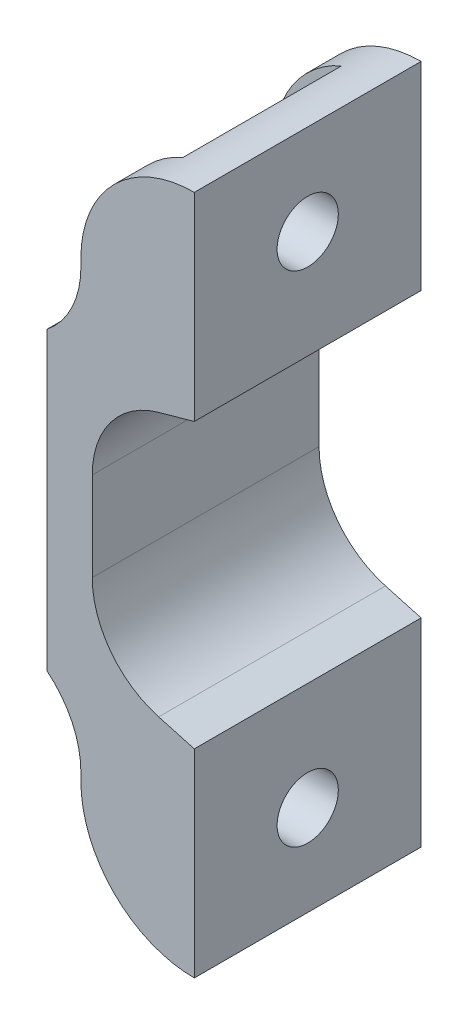
ISO-10303-21;
HEADER;
FILE_DESCRIPTION(('STEP AP214'),'2;1');
FILE_NAME('part.step','',(''),(''),'','','');
FILE_SCHEMA(('AUTOMOTIVE_DESIGN { 1 0 10303 214 1 1 1 1 }'));
ENDSEC;
DATA;
#1=APPLICATION_CONTEXT('core data for automotive mechanical design processes');
#2=APPLICATION_PROTOCOL_DEFINITION('international standard','automotive_design',2000,#1);
#3=PRODUCT_CONTEXT('',#1,'mechanical');
#4=PRODUCT('Part','Part','',(#3));
#5=PRODUCT_RELATED_PRODUCT_CATEGORY('part','',(#4));
#6=PRODUCT_DEFINITION_FORMATION('','',#4);
#7=PRODUCT_DEFINITION_CONTEXT('part definition',#1,'design');
#8=PRODUCT_DEFINITION('design','',#6,#7);
#9=PRODUCT_DEFINITION_SHAPE('','',#8);
#10=(LENGTH_UNIT() NAMED_UNIT(*) SI_UNIT(.MILLI.,.METRE.));
#11=(NAMED_UNIT(*) PLANE_ANGLE_UNIT() SI_UNIT($,.RADIAN.));
#12=(NAMED_UNIT(*) SI_UNIT($,.STERADIAN.) SOLID_ANGLE_UNIT());
#13=UNCERTAINTY_MEASURE_WITH_UNIT(LENGTH_MEASURE(1.E-05),#10,'distance_accuracy_value','');
#14=(GEOMETRIC_REPRESENTATION_CONTEXT(3) GLOBAL_UNCERTAINTY_ASSIGNED_CONTEXT((#13)) GLOBAL_UNIT_ASSIGNED_CONTEXT((#10,
#11,#12)) REPRESENTATION_CONTEXT('',''));
#15=CARTESIAN_POINT('',(0.,0.,0.));
#16=DIRECTION('',(0.,0.,1.));
#17=DIRECTION('',(1.,0.,0.));
#18=AXIS2_PLACEMENT_3D('',#15,#16,#17);
#19=CARTESIAN_POINT('',(0.,30.,-10.));
#20=DIRECTION('',(1.,0.,0.));
#21=DIRECTION('',(0.,0.,-1.));
#22=AXIS2_PLACEMENT_3D('',#19,#20,#21);
#23=PLANE('',#22);
#24=DIRECTION('',(0.,1.,0.));
#25=VECTOR('',#24,1.);
#26=CARTESIAN_POINT('',(0.,30.,10.));
#27=LINE('',#26,#25);
#28=CARTESIAN_POINT('',(0.,12.5,10.));
#29=VERTEX_POINT('',#28);
#30=CARTESIAN_POINT('',(0.,30.,10.));
#31=VERTEX_POINT('',#30);
#32=EDGE_CURVE('E325',#29,#31,#27,.T.);
#33=ORIENTED_EDGE('',*,*,#32,.F.);
#34=DIRECTION('',(0.,0.,1.));
#35=VECTOR('',#34,1.);
#36=CARTESIAN_POINT('',(0.,12.5,-10.));
#37=LINE('',#36,#35);
#38=CARTESIAN_POINT('',(0.,12.5,-10.));
#39=VERTEX_POINT('',#38);
#40=EDGE_CURVE('E299',#39,#29,#37,.T.);
#41=ORIENTED_EDGE('',*,*,#40,.F.);
#42=DIRECTION('',(0.,1.,0.));
#43=VECTOR('',#42,1.);
#44=CARTESIAN_POINT('',(0.,30.,-10.));
#45=LINE('',#44,#43);
#46=CARTESIAN_POINT('',(0.,30.,-10.));
#47=VERTEX_POINT('',#46);
#48=EDGE_CURVE('E255',#39,#47,#45,.T.);
#49=ORIENTED_EDGE('',*,*,#48,.T.);
#50=DIRECTION('',(0.,0.,1.));
#51=VECTOR('',#50,1.);
#52=CARTESIAN_POINT('',(0.,30.,-10.));
#53=LINE('',#52,#51);
#54=EDGE_CURVE('E305',#47,#31,#53,.T.);
#55=ORIENTED_EDGE('',*,*,#54,.T.);
#56=EDGE_LOOP('',(#33,#41,#49,#55));
#57=FACE_BOUND('',#56,.T.);
#58=CARTESIAN_POINT('',(0.,22.,0.));
#59=DIRECTION('',(1.,0.,0.));
#60=DIRECTION('',(0.,0.,-1.));
#61=AXIS2_PLACEMENT_3D('',#58,#59,#60);
#62=CIRCLE('',#61,2.7);
#63=CARTESIAN_POINT('',(0.,22.,-2.69999999999999));
#64=VERTEX_POINT('',#63);
#65=EDGE_CURVE('E346',#64,#64,#62,.T.);
#66=ORIENTED_EDGE('',*,*,#65,.F.);
#67=EDGE_LOOP('',(#66));
#68=FACE_BOUND('',#67,.T.);
#69=ADVANCED_FACE('F49',(#57,#68),#23,.T.);
#70=CARTESIAN_POINT('',(0.,12.5,-10.));
#71=DIRECTION('',(0.267643863786094,-0.963517909629941,0.));
#72=DIRECTION('',(0.963517909629941,0.267643863786094,0.));
#73=AXIS2_PLACEMENT_3D('',#70,#71,#72);
#74=PLANE('',#73);
#75=DIRECTION('',(0.963517909629941,0.267643863786094,0.));
#76=VECTOR('',#75,1.);
#77=CARTESIAN_POINT('',(0.,12.5,10.));
#78=LINE('',#77,#76);
#79=CARTESIAN_POINT('',(-3.14115091028876,11.6274580804753,10.));
#80=VERTEX_POINT('',#79);
#81=EDGE_CURVE('E328',#80,#29,#78,.T.);
#82=ORIENTED_EDGE('',*,*,#81,.F.);
#83=DIRECTION('',(0.,0.,1.));
#84=VECTOR('',#83,1.);
#85=CARTESIAN_POINT('',(-3.14115091028876,11.6274580804753,-10.));
#86=LINE('',#85,#84);
#87=CARTESIAN_POINT('',(-3.14115091028876,11.6274580804753,-10.));
#88=VERTEX_POINT('',#87);
#89=EDGE_CURVE('E488',#80,#88,#86,.F.);
#90=ORIENTED_EDGE('',*,*,#89,.T.);
#91=DIRECTION('',(0.963517909629941,0.267643863786094,0.));
#92=VECTOR('',#91,1.);
#93=CARTESIAN_POINT('',(0.,12.5,-10.));
#94=LINE('',#93,#92);
#95=EDGE_CURVE('E264',#88,#39,#94,.T.);
#96=ORIENTED_EDGE('',*,*,#95,.T.);
#97=ORIENTED_EDGE('',*,*,#40,.T.);
#98=EDGE_LOOP('',(#82,#90,#96,#97));
#99=FACE_BOUND('',#98,.T.);
#100=ADVANCED_FACE('F663',(#99),#74,.T.);
#101=CARTESIAN_POINT('',(-9.00000000000001,10.,-10.));
#102=DIRECTION('',(1.,0.,0.));
#103=DIRECTION('',(0.,0.,-1.));
#104=AXIS2_PLACEMENT_3D('',#101,#102,#103);
#105=PLANE('',#104);
#106=DIRECTION('',(0.,1.,0.));
#107=VECTOR('',#106,1.);
#108=CARTESIAN_POINT('',(-9.00000000000001,10.,-10.));
#109=LINE('',#108,#107);
#110=CARTESIAN_POINT('',(-9.00000000000001,-3.91931480343582,-10.));
#111=VERTEX_POINT('',#110);
#112=CARTESIAN_POINT('',(-9.00000000000001,3.91931480343582,-10.));
#113=VERTEX_POINT('',#112);
#114=EDGE_CURVE('E311',#111,#113,#109,.T.);
#115=ORIENTED_EDGE('',*,*,#114,.T.);
#116=DIRECTION('',(0.,0.,1.));
#117=VECTOR('',#116,1.);
#118=CARTESIAN_POINT('',(-9.00000000000001,3.91931480343582,10.));
#119=LINE('',#118,#117);
#120=CARTESIAN_POINT('',(-9.00000000000001,3.91931480343582,10.));
#121=VERTEX_POINT('',#120);
#122=EDGE_CURVE('E484',#113,#121,#119,.T.);
#123=ORIENTED_EDGE('',*,*,#122,.T.);
#124=DIRECTION('',(0.,1.,0.));
#125=VECTOR('',#124,1.);
#126=CARTESIAN_POINT('',(-9.00000000000001,10.,10.));
#127=LINE('',#126,#125);
#128=CARTESIAN_POINT('',(-9.00000000000001,-3.91931480343582,10.));
#129=VERTEX_POINT('',#128);
#130=EDGE_CURVE('E331',#129,#121,#127,.T.);
#131=ORIENTED_EDGE('',*,*,#130,.F.);
#132=DIRECTION('',(0.,0.,1.));
#133=VECTOR('',#132,1.);
#134=CARTESIAN_POINT('',(-9.00000000000001,-3.91931480343582,-10.));
#135=LINE('',#134,#133);
#136=EDGE_CURVE('E481',#129,#111,#135,.F.);
#137=ORIENTED_EDGE('',*,*,#136,.T.);
#138=EDGE_LOOP('',(#115,#123,#131,#137));
#139=FACE_BOUND('',#138,.T.);
#140=ADVANCED_FACE('F668',(#139),#105,.T.);
#141=CARTESIAN_POINT('',(0.,-12.5,-10.));
#142=DIRECTION('',(0.267643863786094,0.963517909629941,0.));
#143=DIRECTION('',(-0.963517909629941,0.267643863786094,0.));
#144=AXIS2_PLACEMENT_3D('',#141,#142,#143);
#145=PLANE('',#144);
#146=DIRECTION('',(-0.963517909629941,0.267643863786094,0.));
#147=VECTOR('',#146,1.);
#148=CARTESIAN_POINT('',(0.,-12.5,-10.));
#149=LINE('',#148,#147);
#150=CARTESIAN_POINT('',(0.,-12.5,-10.));
#151=VERTEX_POINT('',#150);
#152=CARTESIAN_POINT('',(-3.14115091028876,-11.6274580804753,-10.));
#153=VERTEX_POINT('',#152);
#154=EDGE_CURVE('E315',#151,#153,#149,.T.);
#155=ORIENTED_EDGE('',*,*,#154,.T.);
#156=DIRECTION('',(0.,0.,1.));
#157=VECTOR('',#156,1.);
#158=CARTESIAN_POINT('',(-3.14115091028876,-11.6274580804753,10.));
#159=LINE('',#158,#157);
#160=CARTESIAN_POINT('',(-3.14115091028876,-11.6274580804753,10.));
#161=VERTEX_POINT('',#160);
#162=EDGE_CURVE('E490',#153,#161,#159,.T.);
#163=ORIENTED_EDGE('',*,*,#162,.T.);
#164=DIRECTION('',(-0.963517909629941,0.267643863786094,0.));
#165=VECTOR('',#164,1.);
#166=CARTESIAN_POINT('',(0.,-12.5,10.));
#167=LINE('',#166,#165);
#168=CARTESIAN_POINT('',(0.,-12.5,10.));
#169=VERTEX_POINT('',#168);
#170=EDGE_CURVE('E335',#169,#161,#167,.T.);
#171=ORIENTED_EDGE('',*,*,#170,.F.);
#172=DIRECTION('',(0.,0.,1.));
#173=VECTOR('',#172,1.);
#174=CARTESIAN_POINT('',(0.,-12.5,-10.));
#175=LINE('',#174,#173);
#176=EDGE_CURVE('E291',#151,#169,#175,.T.);
#177=ORIENTED_EDGE('',*,*,#176,.F.);
#178=EDGE_LOOP('',(#155,#163,#171,#177));
#179=FACE_BOUND('',#178,.T.);
#180=ADVANCED_FACE('F679',(#179),#145,.T.);
#181=CARTESIAN_POINT('',(0.,-30.,-10.));
#182=DIRECTION('',(1.,0.,0.));
#183=DIRECTION('',(0.,0.,-1.));
#184=AXIS2_PLACEMENT_3D('',#181,#182,#183);
#185=PLANE('',#184);
#186=ORIENTED_EDGE('',*,*,#176,.T.);
#187=DIRECTION('',(0.,1.,0.));
#188=VECTOR('',#187,1.);
#189=CARTESIAN_POINT('',(0.,-30.,10.));
#190=LINE('',#189,#188);
#191=CARTESIAN_POINT('',(0.,-30.,10.));
#192=VERTEX_POINT('',#191);
#193=EDGE_CURVE('E248',#192,#169,#190,.T.);
#194=ORIENTED_EDGE('',*,*,#193,.F.);
#195=DIRECTION('',(0.,0.,1.));
#196=VECTOR('',#195,1.);
#197=CARTESIAN_POINT('',(0.,-30.,-10.));
#198=LINE('',#197,#196);
#199=CARTESIAN_POINT('',(0.,-30.,-10.));
#200=VERTEX_POINT('',#199);
#201=EDGE_CURVE('E283',#200,#192,#198,.T.);
#202=ORIENTED_EDGE('',*,*,#201,.F.);
#203=DIRECTION('',(0.,1.,0.));
#204=VECTOR('',#203,1.);
#205=CARTESIAN_POINT('',(0.,-30.,-10.));
#206=LINE('',#205,#204);
#207=EDGE_CURVE('E319',#200,#151,#206,.T.);
#208=ORIENTED_EDGE('',*,*,#207,.T.);
#209=EDGE_LOOP('',(#186,#194,#202,#208));
#210=FACE_BOUND('',#209,.T.);
#211=CARTESIAN_POINT('',(0.,-22.,0.));
#212=DIRECTION('',(1.,0.,0.));
#213=DIRECTION('',(0.,0.,-1.));
#214=AXIS2_PLACEMENT_3D('',#211,#212,#213);
#215=CIRCLE('',#214,2.7);
#216=CARTESIAN_POINT('',(0.,-22.,-2.7));
#217=VERTEX_POINT('',#216);
#218=EDGE_CURVE('E342',#217,#217,#215,.T.);
#219=ORIENTED_EDGE('',*,*,#218,.F.);
#220=EDGE_LOOP('',(#219));
#221=FACE_BOUND('',#220,.T.);
#222=ADVANCED_FACE('F683',(#210,#221),#185,.T.);
#223=CARTESIAN_POINT('',(-4.,-15.5403425982821,-10.));
#224=DIRECTION('',(-1.,0.,0.));
#225=DIRECTION('',(0.,0.,1.));
#226=AXIS2_PLACEMENT_3D('',#223,#224,#225);
#227=PLANE('',#226);
#228=DIRECTION('',(0.,-1.,0.));
#229=VECTOR('',#228,1.);
#230=CARTESIAN_POINT('',(-4.,-15.5403425982821,6.99999999999999));
#231=LINE('',#230,#229);
#232=CARTESIAN_POINT('',(-4.,-17.0605138974231,6.99999999999999));
#233=VERTEX_POINT('',#232);
#234=CARTESIAN_POINT('',(-4.,-29.1651513899117,6.99999999999999));
#235=VERTEX_POINT('',#234);
#236=EDGE_CURVE('E347',#233,#235,#231,.T.);
#237=ORIENTED_EDGE('',*,*,#236,.F.);
#238=DIRECTION('',(0.,0.,1.));
#239=VECTOR('',#238,1.);
#240=CARTESIAN_POINT('',(-4.,-17.0605138974231,-7.00000000000001));
#241=LINE('',#240,#239);
#242=CARTESIAN_POINT('',(-4.,-17.0605138974231,-7.00000000000001));
#243=VERTEX_POINT('',#242);
#244=EDGE_CURVE('E58',#233,#243,#241,.F.);
#245=ORIENTED_EDGE('',*,*,#244,.T.);
#246=DIRECTION('',(0.,1.,0.));
#247=VECTOR('',#246,1.);
#248=CARTESIAN_POINT('',(-4.,-15.5403425982821,-7.00000000000001));
#249=LINE('',#248,#247);
#250=CARTESIAN_POINT('',(-4.,-29.1651513899117,-7.00000000000001));
#251=VERTEX_POINT('',#250);
#252=EDGE_CURVE('E353',#251,#243,#249,.T.);
#253=ORIENTED_EDGE('',*,*,#252,.F.);
#254=DIRECTION('',(0.,0.,1.));
#255=VECTOR('',#254,1.);
#256=CARTESIAN_POINT('',(-4.,-29.1651513899117,-7.00000000000001));
#257=LINE('',#256,#255);
#258=EDGE_CURVE('E409',#251,#235,#257,.T.);
#259=ORIENTED_EDGE('',*,*,#258,.T.);
#260=EDGE_LOOP('',(#237,#245,#253,#259));
#261=FACE_BOUND('',#260,.T.);
#262=CARTESIAN_POINT('',(-4.,-22.,0.));
#263=DIRECTION('',(-1.,0.,0.));
#264=DIRECTION('',(0.,0.,1.));
#265=AXIS2_PLACEMENT_3D('',#262,#263,#264);
#266=CIRCLE('',#265,2.7);
#267=CARTESIAN_POINT('',(-4.,-22.,2.7));
#268=VERTEX_POINT('',#267);
#269=EDGE_CURVE('E249',#268,#268,#266,.T.);
#270=ORIENTED_EDGE('',*,*,#269,.F.);
#271=EDGE_LOOP('',(#270));
#272=FACE_BOUND('',#271,.T.);
#273=ADVANCED_FACE('F687',(#261,#272),#227,.T.);
#274=CARTESIAN_POINT('',(-13.,-13.0403425982821,-10.));
#275=DIRECTION('',(-0.267643863786095,-0.963517909629941,0.));
#276=DIRECTION('',(0.963517909629941,-0.267643863786095,0.));
#277=AXIS2_PLACEMENT_3D('',#274,#275,#276);
#278=PLANE('',#277);
#279=DIRECTION('',(-0.963517909629941,0.267643863786095,0.));
#280=VECTOR('',#279,1.);
#281=CARTESIAN_POINT('',(-13.,-13.0403425982821,-7.00000000000001));
#282=LINE('',#281,#280);
#283=CARTESIAN_POINT('',(-5.46471227242781,-15.1334780781633,-7.00000000000001));
#284=VERTEX_POINT('',#283);
#285=CARTESIAN_POINT('',(-13.,-13.0403425982821,-7.00000000000001));
#286=VERTEX_POINT('',#285);
#287=EDGE_CURVE('E569',#284,#286,#282,.T.);
#288=ORIENTED_EDGE('',*,*,#287,.F.);
#289=DIRECTION('',(0.,0.,1.));
#290=VECTOR('',#289,1.);
#291=CARTESIAN_POINT('',(-5.46471227242781,-15.1334780781633,6.99999999999999));
#292=LINE('',#291,#290);
#293=CARTESIAN_POINT('',(-5.46471227242781,-15.1334780781633,6.99999999999999));
#294=VERTEX_POINT('',#293);
#295=EDGE_CURVE('E518',#284,#294,#292,.T.);
#296=ORIENTED_EDGE('',*,*,#295,.T.);
#297=DIRECTION('',(0.963517909629941,-0.267643863786095,0.));
#298=VECTOR('',#297,1.);
#299=CARTESIAN_POINT('',(-13.,-13.0403425982821,6.99999999999999));
#300=LINE('',#299,#298);
#301=CARTESIAN_POINT('',(-13.,-13.0403425982821,6.99999999999999));
#302=VERTEX_POINT('',#301);
#303=EDGE_CURVE('E566',#302,#294,#300,.T.);
#304=ORIENTED_EDGE('',*,*,#303,.F.);
#305=DIRECTION('',(0.,0.,1.));
#306=VECTOR('',#305,1.);
#307=CARTESIAN_POINT('',(-13.,-13.0403425982821,-10.));
#308=LINE('',#307,#306);
#309=EDGE_CURVE('E276',#286,#302,#308,.T.);
#310=ORIENTED_EDGE('',*,*,#309,.F.);
#311=EDGE_LOOP('',(#288,#296,#304,#310));
#312=FACE_BOUND('',#311,.T.);
#313=ADVANCED_FACE('F691',(#312),#278,.T.);
#314=CARTESIAN_POINT('',(-13.,-13.0403425982821,-10.));
#315=DIRECTION('',(-1.,0.,0.));
#316=DIRECTION('',(0.,0.,1.));
#317=AXIS2_PLACEMENT_3D('',#314,#315,#316);
#318=PLANE('',#317);
#319=CARTESIAN_POINT('',(-13.,-13.0403425982821,-10.));
#320=VERTEX_POINT('',#319);
#321=EDGE_CURVE('E277',#320,#286,#308,.T.);
#322=ORIENTED_EDGE('',*,*,#321,.T.);
#323=ORIENTED_EDGE('',*,*,#309,.T.);
#324=CARTESIAN_POINT('',(-13.,-13.0403425982821,10.));
#325=VERTEX_POINT('',#324);
#326=EDGE_CURVE('E246',#302,#325,#308,.T.);
#327=ORIENTED_EDGE('',*,*,#326,.T.);
#328=DIRECTION('',(0.,-1.,0.));
#329=VECTOR('',#328,1.);
#330=CARTESIAN_POINT('',(-13.,-13.0403425982821,10.));
#331=LINE('',#330,#329);
#332=CARTESIAN_POINT('',(-13.,13.0403425982821,10.));
#333=VERTEX_POINT('',#332);
#334=EDGE_CURVE('E226',#333,#325,#331,.T.);
#335=ORIENTED_EDGE('',*,*,#334,.F.);
#336=DIRECTION('',(0.,0.,1.));
#337=VECTOR('',#336,1.);
#338=CARTESIAN_POINT('',(-13.,13.0403425982821,-10.));
#339=LINE('',#338,#337);
#340=CARTESIAN_POINT('',(-13.,13.0403425982821,7.));
#341=VERTEX_POINT('',#340);
#342=EDGE_CURVE('E242',#341,#333,#339,.T.);
#343=ORIENTED_EDGE('',*,*,#342,.F.);
#344=CARTESIAN_POINT('',(-13.,13.0403425982821,-7.));
#345=VERTEX_POINT('',#344);
#346=EDGE_CURVE('E254',#345,#341,#339,.T.);
#347=ORIENTED_EDGE('',*,*,#346,.F.);
#348=CARTESIAN_POINT('',(-13.,13.0403425982821,-10.));
#349=VERTEX_POINT('',#348);
#350=EDGE_CURVE('E257',#349,#345,#339,.T.);
#351=ORIENTED_EDGE('',*,*,#350,.F.);
#352=DIRECTION('',(0.,-1.,0.));
#353=VECTOR('',#352,1.);
#354=CARTESIAN_POINT('',(-13.,-13.0403425982821,-10.));
#355=LINE('',#354,#353);
#356=EDGE_CURVE('E322',#349,#320,#355,.T.);
#357=ORIENTED_EDGE('',*,*,#356,.T.);
#358=EDGE_LOOP('',(#322,#323,#327,#335,#343,#347,#351,#357));
#359=FACE_BOUND('',#358,.T.);
#360=ADVANCED_FACE('F240',(#359),#318,.T.);
#361=CARTESIAN_POINT('',(-13.,13.0403425982821,-10.));
#362=DIRECTION('',(-0.267643863786095,0.963517909629941,0.));
#363=DIRECTION('',(-0.963517909629941,-0.267643863786095,0.));
#364=AXIS2_PLACEMENT_3D('',#361,#362,#363);
#365=PLANE('',#364);
#366=DIRECTION('',(-0.963517909629941,-0.267643863786095,0.));
#367=VECTOR('',#366,1.);
#368=CARTESIAN_POINT('',(-13.,13.0403425982821,7.));
#369=LINE('',#368,#367);
#370=CARTESIAN_POINT('',(-5.46471227242781,15.1334780781633,7.));
#371=VERTEX_POINT('',#370);
#372=EDGE_CURVE('E358',#371,#341,#369,.T.);
#373=ORIENTED_EDGE('',*,*,#372,.F.);
#374=DIRECTION('',(0.,0.,1.));
#375=VECTOR('',#374,1.);
#376=CARTESIAN_POINT('',(-5.46471227242781,15.1334780781633,-7.));
#377=LINE('',#376,#375);
#378=CARTESIAN_POINT('',(-5.46471227242781,15.1334780781633,-7.));
#379=VERTEX_POINT('',#378);
#380=EDGE_CURVE('E512',#371,#379,#377,.F.);
#381=ORIENTED_EDGE('',*,*,#380,.T.);
#382=DIRECTION('',(0.963517909629941,0.267643863786095,0.));
#383=VECTOR('',#382,1.);
#384=CARTESIAN_POINT('',(-13.,13.0403425982821,-7.));
#385=LINE('',#384,#383);
#386=EDGE_CURVE('E355',#345,#379,#385,.T.);
#387=ORIENTED_EDGE('',*,*,#386,.F.);
#388=ORIENTED_EDGE('',*,*,#346,.T.);
#389=EDGE_LOOP('',(#373,#381,#387,#388));
#390=FACE_BOUND('',#389,.T.);
#391=ADVANCED_FACE('F649',(#390),#365,.T.);
#392=CARTESIAN_POINT('',(-4.,15.5403425982821,-10.));
#393=DIRECTION('',(-1.,0.,0.));
#394=DIRECTION('',(0.,0.,1.));
#395=AXIS2_PLACEMENT_3D('',#392,#393,#394);
#396=PLANE('',#395);
#397=DIRECTION('',(0.,1.,0.));
#398=VECTOR('',#397,1.);
#399=CARTESIAN_POINT('',(-4.,15.5403425982821,-7.));
#400=LINE('',#399,#398);
#401=CARTESIAN_POINT('',(-4.,17.0605138974231,-7.));
#402=VERTEX_POINT('',#401);
#403=CARTESIAN_POINT('',(-4.,29.1651513899117,-7.));
#404=VERTEX_POINT('',#403);
#405=EDGE_CURVE('E572',#402,#404,#400,.T.);
#406=ORIENTED_EDGE('',*,*,#405,.F.);
#407=DIRECTION('',(0.,0.,1.));
#408=VECTOR('',#407,1.);
#409=CARTESIAN_POINT('',(-4.,17.0605138974231,7.));
#410=LINE('',#409,#408);
#411=CARTESIAN_POINT('',(-4.,17.0605138974231,7.));
#412=VERTEX_POINT('',#411);
#413=EDGE_CURVE('E505',#402,#412,#410,.T.);
#414=ORIENTED_EDGE('',*,*,#413,.T.);
#415=DIRECTION('',(0.,-1.,0.));
#416=VECTOR('',#415,1.);
#417=CARTESIAN_POINT('',(-4.,15.5403425982821,7.));
#418=LINE('',#417,#416);
#419=CARTESIAN_POINT('',(-4.,29.1651513899117,7.));
#420=VERTEX_POINT('',#419);
#421=EDGE_CURVE('E308',#420,#412,#418,.T.);
#422=ORIENTED_EDGE('',*,*,#421,.F.);
#423=DIRECTION('',(0.,0.,1.));
#424=VECTOR('',#423,1.);
#425=CARTESIAN_POINT('',(-4.,29.1651513899117,7.));
#426=LINE('',#425,#424);
#427=EDGE_CURVE('E438',#420,#404,#426,.F.);
#428=ORIENTED_EDGE('',*,*,#427,.T.);
#429=EDGE_LOOP('',(#406,#414,#422,#428));
#430=FACE_BOUND('',#429,.T.);
#431=CARTESIAN_POINT('',(-4.,22.,0.));
#432=DIRECTION('',(-1.,0.,0.));
#433=DIRECTION('',(0.,0.,1.));
#434=AXIS2_PLACEMENT_3D('',#431,#432,#433);
#435=CIRCLE('',#434,2.7);
#436=CARTESIAN_POINT('',(-4.,22.,2.70000000000001));
#437=VERTEX_POINT('',#436);
#438=EDGE_CURVE('E351',#437,#437,#435,.T.);
#439=ORIENTED_EDGE('',*,*,#438,.F.);
#440=EDGE_LOOP('',(#439));
#441=FACE_BOUND('',#440,.T.);
#442=ADVANCED_FACE('F629',(#430,#441),#396,.T.);
#443=CARTESIAN_POINT('',(0.,0.,-10.));
#444=DIRECTION('',(0.,0.,-1.));
#445=DIRECTION('',(-1.,0.,0.));
#446=AXIS2_PLACEMENT_3D('',#443,#444,#445);
#447=PLANE('',#446);
#448=ORIENTED_EDGE('',*,*,#207,.F.);
#449=CARTESIAN_POINT('',(0.,-20.,-10.));
#450=DIRECTION('',(0.,0.,-1.));
#451=DIRECTION('',(-1.,0.,0.));
#452=AXIS2_PLACEMENT_3D('',#449,#450,#451);
#453=CIRCLE('',#452,10.);
#454=CARTESIAN_POINT('',(-10.,-20.,-10.));
#455=VERTEX_POINT('',#454);
#456=EDGE_CURVE('E403',#200,#455,#453,.T.);
#457=ORIENTED_EDGE('',*,*,#456,.T.);
#458=DIRECTION('',(0.,1.,0.));
#459=VECTOR('',#458,1.);
#460=CARTESIAN_POINT('',(-10.,-30.,-10.));
#461=LINE('',#460,#459);
#462=CARTESIAN_POINT('',(-10.,-19.2853405966805,-10.));
#463=VERTEX_POINT('',#462);
#464=EDGE_CURVE('E375',#455,#463,#461,.T.);
#465=ORIENTED_EDGE('',*,*,#464,.T.);
#466=CARTESIAN_POINT('',(-18.,-19.2853405966805,-10.));
#467=DIRECTION('',(0.,0.,-1.));
#468=DIRECTION('',(-1.,0.,0.));
#469=AXIS2_PLACEMENT_3D('',#466,#467,#468);
#470=CIRCLE('',#469,8.);
#471=EDGE_CURVE('E478',#463,#320,#470,.F.);
#472=ORIENTED_EDGE('',*,*,#471,.T.);
#473=ORIENTED_EDGE('',*,*,#356,.F.);
#474=CARTESIAN_POINT('',(-18.,19.2853405966805,-10.));
#475=DIRECTION('',(0.,0.,-1.));
#476=DIRECTION('',(-1.,0.,0.));
#477=AXIS2_PLACEMENT_3D('',#474,#475,#476);
#478=CIRCLE('',#477,8.);
#479=CARTESIAN_POINT('',(-10.,19.2853405966805,-10.));
#480=VERTEX_POINT('',#479);
#481=EDGE_CURVE('E467',#349,#480,#478,.F.);
#482=ORIENTED_EDGE('',*,*,#481,.T.);
#483=DIRECTION('',(0.,1.,0.));
#484=VECTOR('',#483,1.);
#485=CARTESIAN_POINT('',(-10.,30.,-10.));
#486=LINE('',#485,#484);
#487=CARTESIAN_POINT('',(-10.,20.,-10.));
#488=VERTEX_POINT('',#487);
#489=EDGE_CURVE('E366',#480,#488,#486,.T.);
#490=ORIENTED_EDGE('',*,*,#489,.T.);
#491=CARTESIAN_POINT('',(0.,20.,-10.));
#492=DIRECTION('',(0.,0.,-1.));
#493=DIRECTION('',(-1.,0.,0.));
#494=AXIS2_PLACEMENT_3D('',#491,#492,#493);
#495=CIRCLE('',#494,10.);
#496=EDGE_CURVE('E563',#488,#47,#495,.T.);
#497=ORIENTED_EDGE('',*,*,#496,.T.);
#498=ORIENTED_EDGE('',*,*,#48,.F.);
#499=ORIENTED_EDGE('',*,*,#95,.F.);
#500=CARTESIAN_POINT('',(-1.00000000000001,3.91931480343582,-10.));
#501=DIRECTION('',(0.,0.,-1.));
#502=DIRECTION('',(-1.,0.,0.));
#503=AXIS2_PLACEMENT_3D('',#500,#501,#502);
#504=CIRCLE('',#503,8.);
#505=EDGE_CURVE('E496',#88,#113,#504,.F.);
#506=ORIENTED_EDGE('',*,*,#505,.T.);
#507=ORIENTED_EDGE('',*,*,#114,.F.);
#508=CARTESIAN_POINT('',(-1.00000000000001,-3.91931480343582,-10.));
#509=DIRECTION('',(0.,0.,-1.));
#510=DIRECTION('',(-1.,0.,0.));
#511=AXIS2_PLACEMENT_3D('',#508,#509,#510);
#512=CIRCLE('',#511,8.);
#513=EDGE_CURVE('E502',#111,#153,#512,.F.);
#514=ORIENTED_EDGE('',*,*,#513,.T.);
#515=ORIENTED_EDGE('',*,*,#154,.F.);
#516=EDGE_LOOP('',(#448,#457,#465,#472,#473,#482,#490,#497,#498,#499,#506,#507,#514,#515));
#517=FACE_BOUND('',#516,.T.);
#518=ADVANCED_FACE('F674',(#517),#447,.T.);
#519=CARTESIAN_POINT('',(0.,0.,10.));
#520=DIRECTION('',(0.,0.,-1.));
#521=DIRECTION('',(-1.,0.,0.));
#522=AXIS2_PLACEMENT_3D('',#519,#520,#521);
#523=PLANE('',#522);
#524=ORIENTED_EDGE('',*,*,#334,.T.);
#525=CARTESIAN_POINT('',(-18.,-19.2853405966805,10.));
#526=DIRECTION('',(0.,0.,-1.));
#527=DIRECTION('',(-1.,0.,0.));
#528=AXIS2_PLACEMENT_3D('',#525,#526,#527);
#529=CIRCLE('',#528,8.);
#530=CARTESIAN_POINT('',(-10.,-19.2853405966805,10.));
#531=VERTEX_POINT('',#530);
#532=EDGE_CURVE('E473',#325,#531,#529,.T.);
#533=ORIENTED_EDGE('',*,*,#532,.T.);
#534=DIRECTION('',(0.,-1.,0.));
#535=VECTOR('',#534,1.);
#536=CARTESIAN_POINT('',(-10.,-30.,10.));
#537=LINE('',#536,#535);
#538=CARTESIAN_POINT('',(-10.,-20.,10.));
#539=VERTEX_POINT('',#538);
#540=EDGE_CURVE('E367',#531,#539,#537,.T.);
#541=ORIENTED_EDGE('',*,*,#540,.T.);
#542=CARTESIAN_POINT('',(0.,-20.,10.));
#543=DIRECTION('',(0.,0.,-1.));
#544=DIRECTION('',(-1.,0.,0.));
#545=AXIS2_PLACEMENT_3D('',#542,#543,#544);
#546=CIRCLE('',#545,10.);
#547=EDGE_CURVE('E428',#539,#192,#546,.F.);
#548=ORIENTED_EDGE('',*,*,#547,.T.);
#549=ORIENTED_EDGE('',*,*,#193,.T.);
#550=ORIENTED_EDGE('',*,*,#170,.T.);
#551=CARTESIAN_POINT('',(-1.00000000000001,-3.91931480343582,10.));
#552=DIRECTION('',(0.,0.,-1.));
#553=DIRECTION('',(-1.,0.,0.));
#554=AXIS2_PLACEMENT_3D('',#551,#552,#553);
#555=CIRCLE('',#554,8.);
#556=EDGE_CURVE('E499',#161,#129,#555,.T.);
#557=ORIENTED_EDGE('',*,*,#556,.T.);
#558=ORIENTED_EDGE('',*,*,#130,.T.);
#559=CARTESIAN_POINT('',(-1.00000000000001,3.91931480343582,10.));
#560=DIRECTION('',(0.,0.,-1.));
#561=DIRECTION('',(-1.,0.,0.));
#562=AXIS2_PLACEMENT_3D('',#559,#560,#561);
#563=CIRCLE('',#562,8.);
#564=EDGE_CURVE('E494',#121,#80,#563,.T.);
#565=ORIENTED_EDGE('',*,*,#564,.T.);
#566=ORIENTED_EDGE('',*,*,#81,.T.);
#567=ORIENTED_EDGE('',*,*,#32,.T.);
#568=CARTESIAN_POINT('',(0.,20.,10.));
#569=DIRECTION('',(0.,0.,-1.));
#570=DIRECTION('',(-1.,0.,0.));
#571=AXIS2_PLACEMENT_3D('',#568,#569,#570);
#572=CIRCLE('',#571,10.);
#573=CARTESIAN_POINT('',(-10.,20.,10.));
#574=VERTEX_POINT('',#573);
#575=EDGE_CURVE('E425',#31,#574,#572,.F.);
#576=ORIENTED_EDGE('',*,*,#575,.T.);
#577=DIRECTION('',(0.,-1.,0.));
#578=VECTOR('',#577,1.);
#579=CARTESIAN_POINT('',(-10.,30.,10.));
#580=LINE('',#579,#578);
#581=CARTESIAN_POINT('',(-10.,19.2853405966805,10.));
#582=VERTEX_POINT('',#581);
#583=EDGE_CURVE('E229',#574,#582,#580,.T.);
#584=ORIENTED_EDGE('',*,*,#583,.T.);
#585=CARTESIAN_POINT('',(-18.,19.2853405966805,10.));
#586=DIRECTION('',(0.,0.,-1.));
#587=DIRECTION('',(-1.,0.,0.));
#588=AXIS2_PLACEMENT_3D('',#585,#586,#587);
#589=CIRCLE('',#588,8.);
#590=EDGE_CURVE('E223',#582,#333,#589,.T.);
#591=ORIENTED_EDGE('',*,*,#590,.T.);
#592=EDGE_LOOP('',(#524,#533,#541,#548,#549,#550,#557,#558,#565,#566,#567,#576,#584,#591));
#593=FACE_BOUND('',#592,.T.);
#594=ADVANCED_FACE('F225',(#593),#523,.F.);
#595=CARTESIAN_POINT('',(-13.,22.,0.));
#596=DIRECTION('',(1.,0.,0.));
#597=DIRECTION('',(0.,0.,-1.));
#598=AXIS2_PLACEMENT_3D('',#595,#596,#597);
#599=CYLINDRICAL_SURFACE('',#598,2.7);
#600=ORIENTED_EDGE('',*,*,#438,.T.);
#601=EDGE_LOOP('',(#600));
#602=FACE_BOUND('',#601,.T.);
#603=ORIENTED_EDGE('',*,*,#65,.T.);
#604=EDGE_LOOP('',(#603));
#605=FACE_BOUND('',#604,.T.);
#606=ADVANCED_FACE('F765',(#602,#605),#599,.F.);
#607=CARTESIAN_POINT('',(-13.,-22.,0.));
#608=DIRECTION('',(1.,0.,0.));
#609=DIRECTION('',(0.,0.,-1.));
#610=AXIS2_PLACEMENT_3D('',#607,#608,#609);
#611=CYLINDRICAL_SURFACE('',#610,2.7);
#612=ORIENTED_EDGE('',*,*,#269,.T.);
#613=EDGE_LOOP('',(#612));
#614=FACE_BOUND('',#613,.T.);
#615=ORIENTED_EDGE('',*,*,#218,.T.);
#616=EDGE_LOOP('',(#615));
#617=FACE_BOUND('',#616,.T.);
#618=ADVANCED_FACE('F760',(#614,#617),#611,.F.);
#619=CARTESIAN_POINT('',(-10.,30.,7.));
#620=DIRECTION('',(0.,0.,-1.));
#621=DIRECTION('',(0.,1.,0.));
#622=AXIS2_PLACEMENT_3D('',#619,#620,#621);
#623=PLANE('',#622);
#624=ORIENTED_EDGE('',*,*,#421,.T.);
#625=CARTESIAN_POINT('',(-6.,17.0605138974231,7.));
#626=DIRECTION('',(0.,0.,-1.));
#627=DIRECTION('',(0.,1.,0.));
#628=AXIS2_PLACEMENT_3D('',#625,#626,#627);
#629=CIRCLE('',#628,2.);
#630=EDGE_CURVE('E509',#412,#371,#629,.T.);
#631=ORIENTED_EDGE('',*,*,#630,.T.);
#632=ORIENTED_EDGE('',*,*,#372,.T.);
#633=CARTESIAN_POINT('',(-18.,19.2853405966805,7.));
#634=DIRECTION('',(0.,0.,-1.));
#635=DIRECTION('',(0.,1.,0.));
#636=AXIS2_PLACEMENT_3D('',#633,#634,#635);
#637=CIRCLE('',#636,8.);
#638=CARTESIAN_POINT('',(-10.,19.2853405966805,7.));
#639=VERTEX_POINT('',#638);
#640=EDGE_CURVE('E235',#341,#639,#637,.F.);
#641=ORIENTED_EDGE('',*,*,#640,.T.);
#642=DIRECTION('',(0.,1.,0.));
#643=VECTOR('',#642,1.);
#644=CARTESIAN_POINT('',(-10.,30.,7.));
#645=LINE('',#644,#643);
#646=CARTESIAN_POINT('',(-10.,20.,7.));
#647=VERTEX_POINT('',#646);
#648=EDGE_CURVE('E361',#639,#647,#645,.T.);
#649=ORIENTED_EDGE('',*,*,#648,.T.);
#650=CARTESIAN_POINT('',(0.,20.,7.));
#651=DIRECTION('',(0.,0.,-1.));
#652=DIRECTION('',(0.,1.,0.));
#653=AXIS2_PLACEMENT_3D('',#650,#651,#652);
#654=CIRCLE('',#653,10.);
#655=EDGE_CURVE('E435',#647,#420,#654,.T.);
#656=ORIENTED_EDGE('',*,*,#655,.T.);
#657=EDGE_LOOP('',(#624,#631,#632,#641,#649,#656));
#658=FACE_BOUND('',#657,.T.);
#659=ADVANCED_FACE('F623',(#658),#623,.T.);
#660=CARTESIAN_POINT('',(-10.,0.,0.));
#661=DIRECTION('',(1.,0.,0.));
#662=DIRECTION('',(0.,0.,-1.));
#663=AXIS2_PLACEMENT_3D('',#660,#661,#662);
#664=PLANE('',#663);
#665=ORIENTED_EDGE('',*,*,#648,.F.);
#666=DIRECTION('',(0.,0.,1.));
#667=VECTOR('',#666,1.);
#668=CARTESIAN_POINT('',(-10.,19.2853405966805,0.));
#669=LINE('',#668,#667);
#670=EDGE_CURVE('E448',#639,#582,#669,.T.);
#671=ORIENTED_EDGE('',*,*,#670,.T.);
#672=ORIENTED_EDGE('',*,*,#583,.F.);
#673=DIRECTION('',(0.,0.,1.));
#674=VECTOR('',#673,1.);
#675=CARTESIAN_POINT('',(-10.,20.,8.5));
#676=LINE('',#675,#674);
#677=EDGE_CURVE('E431',#574,#647,#676,.F.);
#678=ORIENTED_EDGE('',*,*,#677,.T.);
#679=EDGE_LOOP('',(#665,#671,#672,#678));
#680=FACE_BOUND('',#679,.T.);
#681=ADVANCED_FACE('F753',(#680),#664,.F.);
#682=CARTESIAN_POINT('',(-10.,30.,-7.));
#683=DIRECTION('',(0.,0.,1.));
#684=DIRECTION('',(0.,-1.,0.));
#685=AXIS2_PLACEMENT_3D('',#682,#683,#684);
#686=PLANE('',#685);
#687=ORIENTED_EDGE('',*,*,#386,.T.);
#688=CARTESIAN_POINT('',(-6.,17.0605138974231,-7.));
#689=DIRECTION('',(0.,0.,1.));
#690=DIRECTION('',(0.,-1.,0.));
#691=AXIS2_PLACEMENT_3D('',#688,#689,#690);
#692=CIRCLE('',#691,2.);
#693=EDGE_CURVE('E515',#379,#402,#692,.T.);
#694=ORIENTED_EDGE('',*,*,#693,.T.);
#695=ORIENTED_EDGE('',*,*,#405,.T.);
#696=CARTESIAN_POINT('',(0.,20.,-7.));
#697=DIRECTION('',(0.,0.,1.));
#698=DIRECTION('',(0.,-1.,0.));
#699=AXIS2_PLACEMENT_3D('',#696,#697,#698);
#700=CIRCLE('',#699,10.);
#701=CARTESIAN_POINT('',(-10.,20.,-7.));
#702=VERTEX_POINT('',#701);
#703=EDGE_CURVE('E442',#404,#702,#700,.T.);
#704=ORIENTED_EDGE('',*,*,#703,.T.);
#705=DIRECTION('',(0.,-1.,0.));
#706=VECTOR('',#705,1.);
#707=CARTESIAN_POINT('',(-10.,30.,-7.));
#708=LINE('',#707,#706);
#709=CARTESIAN_POINT('',(-10.,19.2853405966805,-7.));
#710=VERTEX_POINT('',#709);
#711=EDGE_CURVE('E370',#702,#710,#708,.T.);
#712=ORIENTED_EDGE('',*,*,#711,.T.);
#713=CARTESIAN_POINT('',(-18.,19.2853405966805,-7.));
#714=DIRECTION('',(0.,0.,1.));
#715=DIRECTION('',(0.,-1.,0.));
#716=AXIS2_PLACEMENT_3D('',#713,#714,#715);
#717=CIRCLE('',#716,8.);
#718=EDGE_CURVE('E234',#710,#345,#717,.F.);
#719=ORIENTED_EDGE('',*,*,#718,.T.);
#720=EDGE_LOOP('',(#687,#694,#695,#704,#712,#719));
#721=FACE_BOUND('',#720,.T.);
#722=ADVANCED_FACE('F640',(#721),#686,.T.);
#723=CARTESIAN_POINT('',(-10.,0.,0.));
#724=DIRECTION('',(-1.,0.,0.));
#725=DIRECTION('',(0.,0.,1.));
#726=AXIS2_PLACEMENT_3D('',#723,#724,#725);
#727=PLANE('',#726);
#728=ORIENTED_EDGE('',*,*,#489,.F.);
#729=DIRECTION('',(0.,0.,-1.));
#730=VECTOR('',#729,1.);
#731=CARTESIAN_POINT('',(-10.,19.2853405966805,-7.));
#732=LINE('',#731,#730);
#733=EDGE_CURVE('E451',#480,#710,#732,.F.);
#734=ORIENTED_EDGE('',*,*,#733,.T.);
#735=ORIENTED_EDGE('',*,*,#711,.F.);
#736=DIRECTION('',(0.,0.,1.));
#737=VECTOR('',#736,1.);
#738=CARTESIAN_POINT('',(-10.,20.,0.));
#739=LINE('',#738,#737);
#740=EDGE_CURVE('E444',#702,#488,#739,.F.);
#741=ORIENTED_EDGE('',*,*,#740,.T.);
#742=EDGE_LOOP('',(#728,#734,#735,#741));
#743=FACE_BOUND('',#742,.T.);
#744=ADVANCED_FACE('F643',(#743),#727,.T.);
#745=CARTESIAN_POINT('',(-10.,-30.,-7.00000000000001));
#746=DIRECTION('',(0.,0.,1.));
#747=DIRECTION('',(1.,0.,0.));
#748=AXIS2_PLACEMENT_3D('',#745,#746,#747);
#749=PLANE('',#748);
#750=ORIENTED_EDGE('',*,*,#252,.T.);
#751=CARTESIAN_POINT('',(-6.,-17.0605138974231,-7.00000000000001));
#752=DIRECTION('',(0.,0.,1.));
#753=DIRECTION('',(1.,0.,0.));
#754=AXIS2_PLACEMENT_3D('',#751,#752,#753);
#755=CIRCLE('',#754,2.);
#756=EDGE_CURVE('E11',#243,#284,#755,.T.);
#757=ORIENTED_EDGE('',*,*,#756,.T.);
#758=ORIENTED_EDGE('',*,*,#287,.T.);
#759=CARTESIAN_POINT('',(-18.,-19.2853405966805,-7.00000000000001));
#760=DIRECTION('',(0.,0.,1.));
#761=DIRECTION('',(1.,0.,0.));
#762=AXIS2_PLACEMENT_3D('',#759,#760,#761);
#763=CIRCLE('',#762,8.);
#764=CARTESIAN_POINT('',(-10.,-19.2853405966805,-7.00000000000001));
#765=VERTEX_POINT('',#764);
#766=EDGE_CURVE('E395',#286,#765,#763,.F.);
#767=ORIENTED_EDGE('',*,*,#766,.T.);
#768=DIRECTION('',(0.,-1.,0.));
#769=VECTOR('',#768,1.);
#770=CARTESIAN_POINT('',(-10.,-30.,-7.00000000000001));
#771=LINE('',#770,#769);
#772=CARTESIAN_POINT('',(-10.,-20.,-7.00000000000001));
#773=VERTEX_POINT('',#772);
#774=EDGE_CURVE('E384',#765,#773,#771,.T.);
#775=ORIENTED_EDGE('',*,*,#774,.T.);
#776=CARTESIAN_POINT('',(0.,-20.,-7.00000000000001));
#777=DIRECTION('',(0.,0.,1.));
#778=DIRECTION('',(1.,0.,0.));
#779=AXIS2_PLACEMENT_3D('',#776,#777,#778);
#780=CIRCLE('',#779,10.);
#781=EDGE_CURVE('E393',#773,#251,#780,.T.);
#782=ORIENTED_EDGE('',*,*,#781,.T.);
#783=EDGE_LOOP('',(#750,#757,#758,#767,#775,#782));
#784=FACE_BOUND('',#783,.T.);
#785=ADVANCED_FACE('F391',(#784),#749,.T.);
#786=CARTESIAN_POINT('',(-10.,0.,0.));
#787=DIRECTION('',(1.,0.,0.));
#788=DIRECTION('',(0.,0.,-1.));
#789=AXIS2_PLACEMENT_3D('',#786,#787,#788);
#790=PLANE('',#789);
#791=ORIENTED_EDGE('',*,*,#774,.F.);
#792=DIRECTION('',(0.,0.,-1.));
#793=VECTOR('',#792,1.);
#794=CARTESIAN_POINT('',(-10.,-19.2853405966805,0.));
#795=LINE('',#794,#793);
#796=EDGE_CURVE('E459',#765,#463,#795,.T.);
#797=ORIENTED_EDGE('',*,*,#796,.T.);
#798=ORIENTED_EDGE('',*,*,#464,.F.);
#799=DIRECTION('',(0.,0.,-1.));
#800=VECTOR('',#799,1.);
#801=CARTESIAN_POINT('',(-10.,-20.,-7.00000000000001));
#802=LINE('',#801,#800);
#803=EDGE_CURVE('E400',#455,#773,#802,.F.);
#804=ORIENTED_EDGE('',*,*,#803,.T.);
#805=EDGE_LOOP('',(#791,#797,#798,#804));
#806=FACE_BOUND('',#805,.T.);
#807=ADVANCED_FACE('F401',(#806),#790,.F.);
#808=CARTESIAN_POINT('',(-10.,-30.,6.99999999999999));
#809=DIRECTION('',(0.,0.,-1.));
#810=DIRECTION('',(0.,1.,0.));
#811=AXIS2_PLACEMENT_3D('',#808,#809,#810);
#812=PLANE('',#811);
#813=ORIENTED_EDGE('',*,*,#303,.T.);
#814=CARTESIAN_POINT('',(-6.,-17.0605138974231,6.99999999999999));
#815=DIRECTION('',(0.,0.,-1.));
#816=DIRECTION('',(0.,1.,0.));
#817=AXIS2_PLACEMENT_3D('',#814,#815,#816);
#818=CIRCLE('',#817,2.);
#819=EDGE_CURVE('E72',#294,#233,#818,.T.);
#820=ORIENTED_EDGE('',*,*,#819,.T.);
#821=ORIENTED_EDGE('',*,*,#236,.T.);
#822=CARTESIAN_POINT('',(0.,-20.,6.99999999999999));
#823=DIRECTION('',(0.,0.,-1.));
#824=DIRECTION('',(0.,1.,0.));
#825=AXIS2_PLACEMENT_3D('',#822,#823,#824);
#826=CIRCLE('',#825,10.);
#827=CARTESIAN_POINT('',(-10.,-20.,6.99999999999999));
#828=VERTEX_POINT('',#827);
#829=EDGE_CURVE('E415',#235,#828,#826,.T.);
#830=ORIENTED_EDGE('',*,*,#829,.T.);
#831=DIRECTION('',(0.,1.,0.));
#832=VECTOR('',#831,1.);
#833=CARTESIAN_POINT('',(-10.,-30.,6.99999999999999));
#834=LINE('',#833,#832);
#835=CARTESIAN_POINT('',(-10.,-19.2853405966805,6.99999999999999));
#836=VERTEX_POINT('',#835);
#837=EDGE_CURVE('E371',#828,#836,#834,.T.);
#838=ORIENTED_EDGE('',*,*,#837,.T.);
#839=CARTESIAN_POINT('',(-18.,-19.2853405966805,6.99999999999999));
#840=DIRECTION('',(0.,0.,-1.));
#841=DIRECTION('',(0.,1.,0.));
#842=AXIS2_PLACEMENT_3D('',#839,#840,#841);
#843=CIRCLE('',#842,8.);
#844=EDGE_CURVE('E469',#836,#302,#843,.F.);
#845=ORIENTED_EDGE('',*,*,#844,.T.);
#846=EDGE_LOOP('',(#813,#820,#821,#830,#838,#845));
#847=FACE_BOUND('',#846,.T.);
#848=ADVANCED_FACE('F742',(#847),#812,.T.);
#849=CARTESIAN_POINT('',(-10.,0.,0.));
#850=DIRECTION('',(-1.,0.,0.));
#851=DIRECTION('',(0.,0.,1.));
#852=AXIS2_PLACEMENT_3D('',#849,#850,#851);
#853=PLANE('',#852);
#854=ORIENTED_EDGE('',*,*,#540,.F.);
#855=DIRECTION('',(0.,0.,1.));
#856=VECTOR('',#855,1.);
#857=CARTESIAN_POINT('',(-10.,-19.2853405966805,6.99999999999999));
#858=LINE('',#857,#856);
#859=EDGE_CURVE('E455',#531,#836,#858,.F.);
#860=ORIENTED_EDGE('',*,*,#859,.T.);
#861=ORIENTED_EDGE('',*,*,#837,.F.);
#862=DIRECTION('',(0.,0.,1.));
#863=VECTOR('',#862,1.);
#864=CARTESIAN_POINT('',(-10.,-20.,8.49999999999999));
#865=LINE('',#864,#863);
#866=EDGE_CURVE('E421',#828,#539,#865,.T.);
#867=ORIENTED_EDGE('',*,*,#866,.T.);
#868=EDGE_LOOP('',(#854,#860,#861,#867));
#869=FACE_BOUND('',#868,.T.);
#870=ADVANCED_FACE('F703',(#869),#853,.T.);
#871=CARTESIAN_POINT('',(0.,-20.,-10.));
#872=DIRECTION('',(0.,0.,1.));
#873=DIRECTION('',(1.,0.,0.));
#874=AXIS2_PLACEMENT_3D('',#871,#872,#873);
#875=CYLINDRICAL_SURFACE('',#874,10.);
#876=ORIENTED_EDGE('',*,*,#781,.F.);
#877=ORIENTED_EDGE('',*,*,#803,.F.);
#878=ORIENTED_EDGE('',*,*,#456,.F.);
#879=ORIENTED_EDGE('',*,*,#201,.T.);
#880=ORIENTED_EDGE('',*,*,#547,.F.);
#881=ORIENTED_EDGE('',*,*,#866,.F.);
#882=ORIENTED_EDGE('',*,*,#829,.F.);
#883=ORIENTED_EDGE('',*,*,#258,.F.);
#884=EDGE_LOOP('',(#876,#877,#878,#879,#880,#881,#882,#883));
#885=FACE_BOUND('',#884,.T.);
#886=ADVANCED_FACE('F406',(#885),#875,.T.);
#887=CARTESIAN_POINT('',(0.,20.,-10.));
#888=DIRECTION('',(0.,0.,1.));
#889=DIRECTION('',(1.,0.,0.));
#890=AXIS2_PLACEMENT_3D('',#887,#888,#889);
#891=CYLINDRICAL_SURFACE('',#890,10.);
#892=ORIENTED_EDGE('',*,*,#496,.F.);
#893=ORIENTED_EDGE('',*,*,#740,.F.);
#894=ORIENTED_EDGE('',*,*,#703,.F.);
#895=ORIENTED_EDGE('',*,*,#427,.F.);
#896=ORIENTED_EDGE('',*,*,#655,.F.);
#897=ORIENTED_EDGE('',*,*,#677,.F.);
#898=ORIENTED_EDGE('',*,*,#575,.F.);
#899=ORIENTED_EDGE('',*,*,#54,.F.);
#900=EDGE_LOOP('',(#892,#893,#894,#895,#896,#897,#898,#899));
#901=FACE_BOUND('',#900,.T.);
#902=ADVANCED_FACE('F635',(#901),#891,.T.);
#903=CARTESIAN_POINT('',(-18.,19.2853405966805,-10.));
#904=DIRECTION('',(0.,0.,1.));
#905=DIRECTION('',(1.,0.,0.));
#906=AXIS2_PLACEMENT_3D('',#903,#904,#905);
#907=CYLINDRICAL_SURFACE('',#906,8.);
#908=ORIENTED_EDGE('',*,*,#590,.F.);
#909=ORIENTED_EDGE('',*,*,#670,.F.);
#910=ORIENTED_EDGE('',*,*,#640,.F.);
#911=ORIENTED_EDGE('',*,*,#342,.T.);
#912=EDGE_LOOP('',(#908,#909,#910,#911));
#913=FACE_BOUND('',#912,.T.);
#914=ADVANCED_FACE('F252',(#913),#907,.F.);
#915=CARTESIAN_POINT('',(-18.,19.2853405966805,-10.));
#916=DIRECTION('',(0.,0.,1.));
#917=DIRECTION('',(1.,0.,0.));
#918=AXIS2_PLACEMENT_3D('',#915,#916,#917);
#919=CYLINDRICAL_SURFACE('',#918,8.);
#920=ORIENTED_EDGE('',*,*,#481,.F.);
#921=ORIENTED_EDGE('',*,*,#350,.T.);
#922=ORIENTED_EDGE('',*,*,#718,.F.);
#923=ORIENTED_EDGE('',*,*,#733,.F.);
#924=EDGE_LOOP('',(#920,#921,#922,#923));
#925=FACE_BOUND('',#924,.T.);
#926=ADVANCED_FACE('F645',(#925),#919,.F.);
#927=CARTESIAN_POINT('',(-18.,-19.2853405966805,-10.));
#928=DIRECTION('',(0.,0.,-1.));
#929=DIRECTION('',(-1.,0.,0.));
#930=AXIS2_PLACEMENT_3D('',#927,#928,#929);
#931=CYLINDRICAL_SURFACE('',#930,8.);
#932=ORIENTED_EDGE('',*,*,#532,.F.);
#933=ORIENTED_EDGE('',*,*,#326,.F.);
#934=ORIENTED_EDGE('',*,*,#844,.F.);
#935=ORIENTED_EDGE('',*,*,#859,.F.);
#936=EDGE_LOOP('',(#932,#933,#934,#935));
#937=FACE_BOUND('',#936,.T.);
#938=ADVANCED_FACE('F710',(#937),#931,.F.);
#939=CARTESIAN_POINT('',(-18.,-19.2853405966805,-10.));
#940=DIRECTION('',(0.,0.,-1.));
#941=DIRECTION('',(-1.,0.,0.));
#942=AXIS2_PLACEMENT_3D('',#939,#940,#941);
#943=CYLINDRICAL_SURFACE('',#942,8.);
#944=ORIENTED_EDGE('',*,*,#471,.F.);
#945=ORIENTED_EDGE('',*,*,#796,.F.);
#946=ORIENTED_EDGE('',*,*,#766,.F.);
#947=ORIENTED_EDGE('',*,*,#321,.F.);
#948=EDGE_LOOP('',(#944,#945,#946,#947));
#949=FACE_BOUND('',#948,.T.);
#950=ADVANCED_FACE('F713',(#949),#943,.F.);
#951=CARTESIAN_POINT('',(-1.00000000000001,3.91931480343582,-10.));
#952=DIRECTION('',(0.,0.,-1.));
#953=DIRECTION('',(-1.,0.,0.));
#954=AXIS2_PLACEMENT_3D('',#951,#952,#953);
#955=CYLINDRICAL_SURFACE('',#954,8.);
#956=ORIENTED_EDGE('',*,*,#505,.F.);
#957=ORIENTED_EDGE('',*,*,#89,.F.);
#958=ORIENTED_EDGE('',*,*,#564,.F.);
#959=ORIENTED_EDGE('',*,*,#122,.F.);
#960=EDGE_LOOP('',(#956,#957,#958,#959));
#961=FACE_BOUND('',#960,.T.);
#962=ADVANCED_FACE('F659',(#961),#955,.F.);
#963=CARTESIAN_POINT('',(-1.00000000000001,-3.91931480343582,-10.));
#964=DIRECTION('',(0.,0.,-1.));
#965=DIRECTION('',(-1.,0.,0.));
#966=AXIS2_PLACEMENT_3D('',#963,#964,#965);
#967=CYLINDRICAL_SURFACE('',#966,8.);
#968=ORIENTED_EDGE('',*,*,#513,.F.);
#969=ORIENTED_EDGE('',*,*,#136,.F.);
#970=ORIENTED_EDGE('',*,*,#556,.F.);
#971=ORIENTED_EDGE('',*,*,#162,.F.);
#972=EDGE_LOOP('',(#968,#969,#970,#971));
#973=FACE_BOUND('',#972,.T.);
#974=ADVANCED_FACE('F654',(#973),#967,.F.);
#975=CARTESIAN_POINT('',(-6.,17.0605138974231,-10.));
#976=DIRECTION('',(0.,0.,-1.));
#977=DIRECTION('',(-1.,0.,0.));
#978=AXIS2_PLACEMENT_3D('',#975,#976,#977);
#979=CYLINDRICAL_SURFACE('',#978,2.);
#980=ORIENTED_EDGE('',*,*,#693,.F.);
#981=ORIENTED_EDGE('',*,*,#380,.F.);
#982=ORIENTED_EDGE('',*,*,#630,.F.);
#983=ORIENTED_EDGE('',*,*,#413,.F.);
#984=EDGE_LOOP('',(#980,#981,#982,#983));
#985=FACE_BOUND('',#984,.T.);
#986=ADVANCED_FACE('F652',(#985),#979,.F.);
#987=CARTESIAN_POINT('',(-6.,-17.0605138974231,-10.));
#988=DIRECTION('',(0.,0.,-1.));
#989=DIRECTION('',(-1.,0.,0.));
#990=AXIS2_PLACEMENT_3D('',#987,#988,#989);
#991=CYLINDRICAL_SURFACE('',#990,2.);
#992=ORIENTED_EDGE('',*,*,#756,.F.);
#993=ORIENTED_EDGE('',*,*,#244,.F.);
#994=ORIENTED_EDGE('',*,*,#819,.F.);
#995=ORIENTED_EDGE('',*,*,#295,.F.);
#996=EDGE_LOOP('',(#992,#993,#994,#995));
#997=FACE_BOUND('',#996,.T.);
#998=ADVANCED_FACE('F51',(#997),#991,.F.);
#999=CLOSED_SHELL('',(#69,#100,#140,#180,#222,#273,#313,#360,#391,#442,#518,#594,#606,#618,#659,
#681,#722,#744,#785,#807,#848,#870,#886,#902,#914,#926,#938,#950,#962,#974,#986,#998));
#1000=MANIFOLD_SOLID_BREP('B2',#999);
#1001=ADVANCED_BREP_SHAPE_REPRESENTATION('',(#18,#1000),#14);
#1002=SHAPE_DEFINITION_REPRESENTATION(#9,#1001);
ENDSEC;
END-ISO-10303-21;
